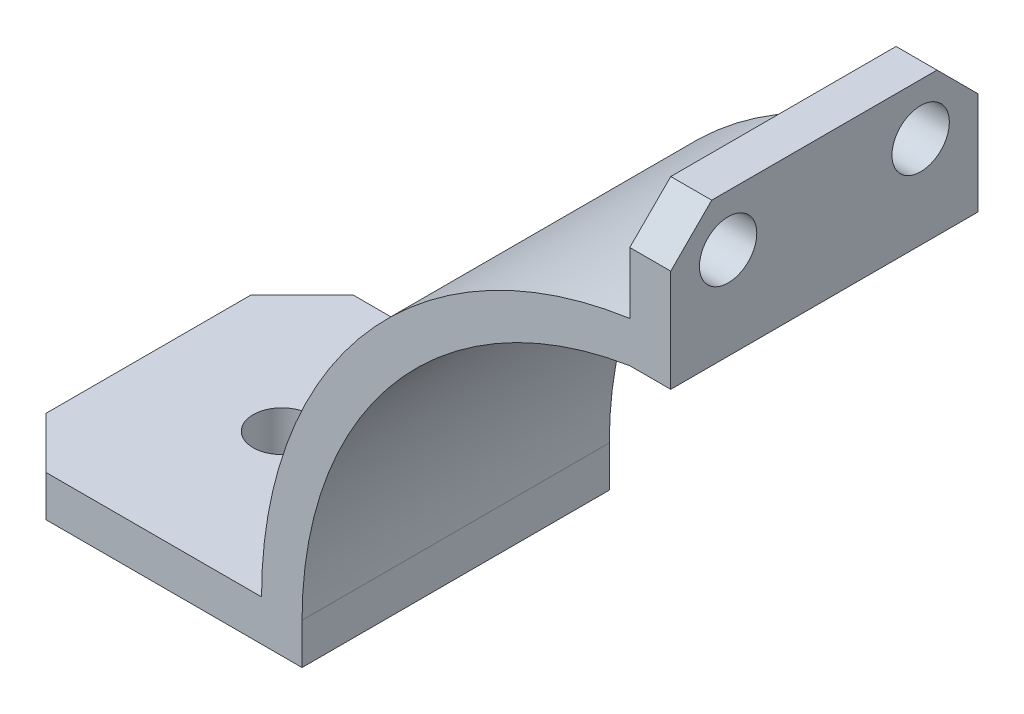
ISO-10303-21;
HEADER;
FILE_DESCRIPTION(('STEP AP214'),'2;1');
FILE_NAME('part.step','',(''),(''),'','','');
FILE_SCHEMA(('AUTOMOTIVE_DESIGN { 1 0 10303 214 1 1 1 1 }'));
ENDSEC;
DATA;
#1=APPLICATION_CONTEXT('core data for automotive mechanical design processes');
#2=APPLICATION_PROTOCOL_DEFINITION('international standard','automotive_design',2000,#1);
#3=PRODUCT_CONTEXT('',#1,'mechanical');
#4=PRODUCT('Part','Part','',(#3));
#5=PRODUCT_RELATED_PRODUCT_CATEGORY('part','',(#4));
#6=PRODUCT_DEFINITION_FORMATION('','',#4);
#7=PRODUCT_DEFINITION_CONTEXT('part definition',#1,'design');
#8=PRODUCT_DEFINITION('design','',#6,#7);
#9=PRODUCT_DEFINITION_SHAPE('','',#8);
#10=(LENGTH_UNIT() NAMED_UNIT(*) SI_UNIT(.MILLI.,.METRE.));
#11=(NAMED_UNIT(*) PLANE_ANGLE_UNIT() SI_UNIT($,.RADIAN.));
#12=(NAMED_UNIT(*) SI_UNIT($,.STERADIAN.) SOLID_ANGLE_UNIT());
#13=UNCERTAINTY_MEASURE_WITH_UNIT(LENGTH_MEASURE(1.E-05),#10,'distance_accuracy_value','');
#14=(GEOMETRIC_REPRESENTATION_CONTEXT(3) GLOBAL_UNCERTAINTY_ASSIGNED_CONTEXT((#13)) GLOBAL_UNIT_ASSIGNED_CONTEXT((#10,
#11,#12)) REPRESENTATION_CONTEXT('',''));
#15=CARTESIAN_POINT('',(0.,0.,0.));
#16=DIRECTION('',(0.,0.,1.));
#17=DIRECTION('',(1.,0.,0.));
#18=AXIS2_PLACEMENT_3D('',#15,#16,#17);
#19=CARTESIAN_POINT('',(0.,0.,15.));
#20=DIRECTION('',(0.,0.,-1.));
#21=DIRECTION('',(-1.,0.,0.));
#22=AXIS2_PLACEMENT_3D('',#19,#20,#21);
#23=CYLINDRICAL_SURFACE('',#22,19.);
#24=CARTESIAN_POINT('',(0.,0.,0.));
#25=DIRECTION('',(0.,0.,-1.));
#26=DIRECTION('',(-1.,0.,0.));
#27=AXIS2_PLACEMENT_3D('',#24,#25,#26);
#28=CIRCLE('',#27,19.);
#29=CARTESIAN_POINT('',(-19.,0.,0.));
#30=VERTEX_POINT('',#29);
#31=CARTESIAN_POINT('',(-3.,18.7616630392937,0.));
#32=VERTEX_POINT('',#31);
#33=EDGE_CURVE('E171',#30,#32,#28,.T.);
#34=ORIENTED_EDGE('',*,*,#33,.T.);
#35=DIRECTION('',(0.,0.,-1.));
#36=VECTOR('',#35,1.);
#37=CARTESIAN_POINT('',(-3.,18.7616630392937,15.));
#38=LINE('',#37,#36);
#39=CARTESIAN_POINT('',(-3.,18.7616630392937,15.));
#40=VERTEX_POINT('',#39);
#41=EDGE_CURVE('E151',#40,#32,#38,.T.);
#42=ORIENTED_EDGE('',*,*,#41,.F.);
#43=CARTESIAN_POINT('',(0.,0.,15.));
#44=DIRECTION('',(0.,0.,-1.));
#45=DIRECTION('',(-1.,0.,0.));
#46=AXIS2_PLACEMENT_3D('',#43,#44,#45);
#47=CIRCLE('',#46,19.);
#48=CARTESIAN_POINT('',(-19.,0.,15.));
#49=VERTEX_POINT('',#48);
#50=EDGE_CURVE('E159',#49,#40,#47,.T.);
#51=ORIENTED_EDGE('',*,*,#50,.F.);
#52=DIRECTION('',(0.,0.,-1.));
#53=VECTOR('',#52,1.);
#54=CARTESIAN_POINT('',(-19.,0.,15.));
#55=LINE('',#54,#53);
#56=EDGE_CURVE('E242',#49,#30,#55,.T.);
#57=ORIENTED_EDGE('',*,*,#56,.T.);
#58=EDGE_LOOP('',(#34,#42,#51,#57));
#59=FACE_BOUND('',#58,.T.);
#60=ADVANCED_FACE('F44',(#59),#23,.F.);
#61=CARTESIAN_POINT('',(-1.,18.7616630392937,15.));
#62=DIRECTION('',(0.,1.,0.));
#63=DIRECTION('',(0.,0.,1.));
#64=AXIS2_PLACEMENT_3D('',#61,#62,#63);
#65=PLANE('',#64);
#66=DIRECTION('',(1.,0.,0.));
#67=VECTOR('',#66,1.);
#68=CARTESIAN_POINT('',(-1.,18.7616630392937,0.));
#69=LINE('',#68,#67);
#70=CARTESIAN_POINT('',(-1.,18.7616630392937,0.));
#71=VERTEX_POINT('',#70);
#72=EDGE_CURVE('E256',#32,#71,#69,.T.);
#73=ORIENTED_EDGE('',*,*,#72,.T.);
#74=DIRECTION('',(0.,0.,-1.));
#75=VECTOR('',#74,1.);
#76=CARTESIAN_POINT('',(-1.,18.7616630392937,15.));
#77=LINE('',#76,#75);
#78=CARTESIAN_POINT('',(-1.,18.7616630392937,15.));
#79=VERTEX_POINT('',#78);
#80=EDGE_CURVE('E154',#79,#71,#77,.T.);
#81=ORIENTED_EDGE('',*,*,#80,.F.);
#82=DIRECTION('',(1.,0.,0.));
#83=VECTOR('',#82,1.);
#84=CARTESIAN_POINT('',(-1.,18.7616630392937,15.));
#85=LINE('',#84,#83);
#86=EDGE_CURVE('E147',#40,#79,#85,.T.);
#87=ORIENTED_EDGE('',*,*,#86,.F.);
#88=ORIENTED_EDGE('',*,*,#41,.T.);
#89=EDGE_LOOP('',(#73,#81,#87,#88));
#90=FACE_BOUND('',#89,.T.);
#91=ADVANCED_FACE('F149',(#90),#65,.F.);
#92=CARTESIAN_POINT('',(-1.,25.7616630392937,15.));
#93=DIRECTION('',(-1.,0.,0.));
#94=DIRECTION('',(0.,-1.,0.));
#95=AXIS2_PLACEMENT_3D('',#92,#93,#94);
#96=PLANE('',#95);
#97=CARTESIAN_POINT('',(-1.,23.2616630392937,2.8));
#98=DIRECTION('',(-1.,0.,0.));
#99=DIRECTION('',(0.,-1.,0.));
#100=AXIS2_PLACEMENT_3D('',#97,#98,#99);
#101=CIRCLE('',#100,1.4);
#102=CARTESIAN_POINT('',(-1.,21.8616630392937,2.8));
#103=VERTEX_POINT('',#102);
#104=EDGE_CURVE('E259',#103,#103,#101,.T.);
#105=ORIENTED_EDGE('',*,*,#104,.T.);
#106=EDGE_LOOP('',(#105));
#107=FACE_BOUND('',#106,.T.);
#108=CARTESIAN_POINT('',(-1.,23.2616630392937,12.2));
#109=DIRECTION('',(-1.,0.,0.));
#110=DIRECTION('',(0.,-1.,0.));
#111=AXIS2_PLACEMENT_3D('',#108,#109,#110);
#112=CIRCLE('',#111,1.4);
#113=CARTESIAN_POINT('',(-1.,21.8616630392937,12.2));
#114=VERTEX_POINT('',#113);
#115=EDGE_CURVE('E271',#114,#114,#112,.T.);
#116=ORIENTED_EDGE('',*,*,#115,.T.);
#117=EDGE_LOOP('',(#116));
#118=FACE_BOUND('',#117,.T.);
#119=DIRECTION('',(0.,0.,-1.));
#120=VECTOR('',#119,1.);
#121=CARTESIAN_POINT('',(-1.,25.7616630392937,15.));
#122=LINE('',#121,#120);
#123=CARTESIAN_POINT('',(-1.,25.7616630392937,13.));
#124=VERTEX_POINT('',#123);
#125=CARTESIAN_POINT('',(-1.,25.7616630392937,2.));
#126=VERTEX_POINT('',#125);
#127=EDGE_CURVE('E176',#124,#126,#122,.T.);
#128=ORIENTED_EDGE('',*,*,#127,.F.);
#129=DIRECTION('',(0.,0.707106781186546,-0.707106781186549));
#130=VECTOR('',#129,1.);
#131=CARTESIAN_POINT('',(-1.,23.7616630392937,15.));
#132=LINE('',#131,#130);
#133=CARTESIAN_POINT('',(-1.,23.7616630392937,15.));
#134=VERTEX_POINT('',#133);
#135=EDGE_CURVE('E53',#124,#134,#132,.F.);
#136=ORIENTED_EDGE('',*,*,#135,.T.);
#137=DIRECTION('',(0.,1.,0.));
#138=VECTOR('',#137,1.);
#139=CARTESIAN_POINT('',(-1.,25.7616630392937,15.));
#140=LINE('',#139,#138);
#141=EDGE_CURVE('E158',#79,#134,#140,.T.);
#142=ORIENTED_EDGE('',*,*,#141,.F.);
#143=ORIENTED_EDGE('',*,*,#80,.T.);
#144=DIRECTION('',(0.,1.,0.));
#145=VECTOR('',#144,1.);
#146=CARTESIAN_POINT('',(-1.,25.7616630392937,0.));
#147=LINE('',#146,#145);
#148=CARTESIAN_POINT('',(-1.,23.7616630392937,0.));
#149=VERTEX_POINT('',#148);
#150=EDGE_CURVE('E254',#71,#149,#147,.T.);
#151=ORIENTED_EDGE('',*,*,#150,.T.);
#152=DIRECTION('',(0.,0.707106781186549,0.707106781186546));
#153=VECTOR('',#152,1.);
#154=CARTESIAN_POINT('',(-1.,25.7616630392937,2.));
#155=LINE('',#154,#153);
#156=EDGE_CURVE('E65',#149,#126,#155,.T.);
#157=ORIENTED_EDGE('',*,*,#156,.T.);
#158=EDGE_LOOP('',(#128,#136,#142,#143,#151,#157));
#159=FACE_BOUND('',#158,.T.);
#160=ADVANCED_FACE('F208',(#107,#118,#159),#96,.F.);
#161=CARTESIAN_POINT('',(-3.,25.7616630392937,15.));
#162=DIRECTION('',(0.,-1.,0.));
#163=DIRECTION('',(0.,0.,-1.));
#164=AXIS2_PLACEMENT_3D('',#161,#162,#163);
#165=PLANE('',#164);
#166=DIRECTION('',(0.,0.,-1.));
#167=VECTOR('',#166,1.);
#168=CARTESIAN_POINT('',(-3.,25.7616630392937,15.));
#169=LINE('',#168,#167);
#170=CARTESIAN_POINT('',(-3.,25.7616630392937,13.));
#171=VERTEX_POINT('',#170);
#172=CARTESIAN_POINT('',(-3.,25.7616630392937,2.));
#173=VERTEX_POINT('',#172);
#174=EDGE_CURVE('E220',#171,#173,#169,.T.);
#175=ORIENTED_EDGE('',*,*,#174,.F.);
#176=DIRECTION('',(1.,0.,0.));
#177=VECTOR('',#176,1.);
#178=CARTESIAN_POINT('',(-3.,25.7616630392937,13.));
#179=LINE('',#178,#177);
#180=EDGE_CURVE('E205',#171,#124,#179,.T.);
#181=ORIENTED_EDGE('',*,*,#180,.T.);
#182=ORIENTED_EDGE('',*,*,#127,.T.);
#183=DIRECTION('',(-1.,0.,0.));
#184=VECTOR('',#183,1.);
#185=CARTESIAN_POINT('',(-3.,25.7616630392937,2.));
#186=LINE('',#185,#184);
#187=EDGE_CURVE('E202',#126,#173,#186,.T.);
#188=ORIENTED_EDGE('',*,*,#187,.T.);
#189=EDGE_LOOP('',(#175,#181,#182,#188));
#190=FACE_BOUND('',#189,.T.);
#191=ADVANCED_FACE('F223',(#190),#165,.F.);
#192=CARTESIAN_POINT('',(-3.,20.7616630392937,15.));
#193=DIRECTION('',(1.,0.,0.));
#194=DIRECTION('',(0.,1.,0.));
#195=AXIS2_PLACEMENT_3D('',#192,#193,#194);
#196=PLANE('',#195);
#197=CARTESIAN_POINT('',(-3.,23.2616630392937,2.8));
#198=DIRECTION('',(-1.,0.,0.));
#199=DIRECTION('',(0.,-1.,0.));
#200=AXIS2_PLACEMENT_3D('',#197,#198,#199);
#201=CIRCLE('',#200,1.4);
#202=CARTESIAN_POINT('',(-3.,21.8616630392937,2.8));
#203=VERTEX_POINT('',#202);
#204=EDGE_CURVE('E274',#203,#203,#201,.T.);
#205=ORIENTED_EDGE('',*,*,#204,.F.);
#206=EDGE_LOOP('',(#205));
#207=FACE_BOUND('',#206,.T.);
#208=CARTESIAN_POINT('',(-3.,23.2616630392937,12.2));
#209=DIRECTION('',(-1.,0.,0.));
#210=DIRECTION('',(0.,-1.,0.));
#211=AXIS2_PLACEMENT_3D('',#208,#209,#210);
#212=CIRCLE('',#211,1.4);
#213=CARTESIAN_POINT('',(-3.,21.8616630392937,12.2));
#214=VERTEX_POINT('',#213);
#215=EDGE_CURVE('E275',#214,#214,#212,.T.);
#216=ORIENTED_EDGE('',*,*,#215,.F.);
#217=EDGE_LOOP('',(#216));
#218=FACE_BOUND('',#217,.T.);
#219=DIRECTION('',(0.,-1.,0.));
#220=VECTOR('',#219,1.);
#221=CARTESIAN_POINT('',(-3.,20.7616630392937,15.));
#222=LINE('',#221,#220);
#223=CARTESIAN_POINT('',(-3.,23.7616630392937,15.));
#224=VERTEX_POINT('',#223);
#225=CARTESIAN_POINT('',(-3.,20.7616630392937,15.));
#226=VERTEX_POINT('',#225);
#227=EDGE_CURVE('E213',#224,#226,#222,.T.);
#228=ORIENTED_EDGE('',*,*,#227,.F.);
#229=DIRECTION('',(0.,-0.707106781186546,0.707106781186549));
#230=VECTOR('',#229,1.);
#231=CARTESIAN_POINT('',(-3.,23.7616630392937,15.));
#232=LINE('',#231,#230);
#233=EDGE_CURVE('E200',#224,#171,#232,.F.);
#234=ORIENTED_EDGE('',*,*,#233,.T.);
#235=ORIENTED_EDGE('',*,*,#174,.T.);
#236=DIRECTION('',(0.,-0.707106781186549,-0.707106781186546));
#237=VECTOR('',#236,1.);
#238=CARTESIAN_POINT('',(-3.,25.7616630392937,2.));
#239=LINE('',#238,#237);
#240=CARTESIAN_POINT('',(-3.,23.7616630392937,0.));
#241=VERTEX_POINT('',#240);
#242=EDGE_CURVE('E198',#173,#241,#239,.T.);
#243=ORIENTED_EDGE('',*,*,#242,.T.);
#244=DIRECTION('',(0.,-1.,0.));
#245=VECTOR('',#244,1.);
#246=CARTESIAN_POINT('',(-3.,20.7616630392937,0.));
#247=LINE('',#246,#245);
#248=CARTESIAN_POINT('',(-3.,20.7616630392937,0.));
#249=VERTEX_POINT('',#248);
#250=EDGE_CURVE('E252',#241,#249,#247,.T.);
#251=ORIENTED_EDGE('',*,*,#250,.T.);
#252=DIRECTION('',(0.,0.,-1.));
#253=VECTOR('',#252,1.);
#254=CARTESIAN_POINT('',(-3.,20.7616630392937,15.));
#255=LINE('',#254,#253);
#256=EDGE_CURVE('E225',#226,#249,#255,.T.);
#257=ORIENTED_EDGE('',*,*,#256,.F.);
#258=EDGE_LOOP('',(#228,#234,#235,#243,#251,#257));
#259=FACE_BOUND('',#258,.T.);
#260=ADVANCED_FACE('F219',(#207,#218,#259),#196,.F.);
#261=CARTESIAN_POINT('',(0.,0.,15.));
#262=DIRECTION('',(0.,0.,-1.));
#263=DIRECTION('',(-1.,0.,0.));
#264=AXIS2_PLACEMENT_3D('',#261,#262,#263);
#265=CYLINDRICAL_SURFACE('',#264,20.9772889610925);
#266=CARTESIAN_POINT('',(0.,0.,0.));
#267=DIRECTION('',(0.,0.,1.));
#268=DIRECTION('',(-1.,0.,0.));
#269=AXIS2_PLACEMENT_3D('',#266,#267,#268);
#270=CIRCLE('',#269,20.9772889610925);
#271=CARTESIAN_POINT('',(-20.9772889610925,0.,0.));
#272=VERTEX_POINT('',#271);
#273=EDGE_CURVE('E250',#249,#272,#270,.T.);
#274=ORIENTED_EDGE('',*,*,#273,.T.);
#275=DIRECTION('',(0.,0.,-1.));
#276=VECTOR('',#275,1.);
#277=CARTESIAN_POINT('',(-20.9772889610925,0.,15.));
#278=LINE('',#277,#276);
#279=CARTESIAN_POINT('',(-20.9772889610925,0.,15.));
#280=VERTEX_POINT('',#279);
#281=EDGE_CURVE('E228',#280,#272,#278,.T.);
#282=ORIENTED_EDGE('',*,*,#281,.F.);
#283=CARTESIAN_POINT('',(0.,0.,15.));
#284=DIRECTION('',(0.,0.,1.));
#285=DIRECTION('',(-1.,0.,0.));
#286=AXIS2_PLACEMENT_3D('',#283,#284,#285);
#287=CIRCLE('',#286,20.9772889610925);
#288=EDGE_CURVE('E266',#226,#280,#287,.T.);
#289=ORIENTED_EDGE('',*,*,#288,.F.);
#290=ORIENTED_EDGE('',*,*,#256,.T.);
#291=EDGE_LOOP('',(#274,#282,#289,#290));
#292=FACE_BOUND('',#291,.T.);
#293=ADVANCED_FACE('F300',(#292),#265,.T.);
#294=CARTESIAN_POINT('',(-34.,0.,15.));
#295=DIRECTION('',(0.,-1.,0.));
#296=DIRECTION('',(0.,0.,-1.));
#297=AXIS2_PLACEMENT_3D('',#294,#295,#296);
#298=PLANE('',#297);
#299=CARTESIAN_POINT('',(-27.4886444805463,0.,7.5));
#300=DIRECTION('',(0.,1.,0.));
#301=DIRECTION('',(0.,0.,1.));
#302=AXIS2_PLACEMENT_3D('',#299,#300,#301);
#303=CIRCLE('',#302,1.4);
#304=CARTESIAN_POINT('',(-27.4886444805463,0.,8.9));
#305=VERTEX_POINT('',#304);
#306=EDGE_CURVE('E281',#305,#305,#303,.T.);
#307=ORIENTED_EDGE('',*,*,#306,.F.);
#308=EDGE_LOOP('',(#307));
#309=FACE_BOUND('',#308,.T.);
#310=DIRECTION('',(-1.,0.,0.));
#311=VECTOR('',#310,1.);
#312=CARTESIAN_POINT('',(-34.,0.,0.));
#313=LINE('',#312,#311);
#314=CARTESIAN_POINT('',(-31.5,0.,0.));
#315=VERTEX_POINT('',#314);
#316=EDGE_CURVE('E247',#272,#315,#313,.T.);
#317=ORIENTED_EDGE('',*,*,#316,.T.);
#318=DIRECTION('',(-0.707106781186549,0.,0.707106781186547));
#319=VECTOR('',#318,1.);
#320=CARTESIAN_POINT('',(-34.,0.,2.5));
#321=LINE('',#320,#319);
#322=CARTESIAN_POINT('',(-34.,0.,2.5));
#323=VERTEX_POINT('',#322);
#324=EDGE_CURVE('E190',#315,#323,#321,.T.);
#325=ORIENTED_EDGE('',*,*,#324,.T.);
#326=DIRECTION('',(0.,0.,-1.));
#327=VECTOR('',#326,1.);
#328=CARTESIAN_POINT('',(-34.,0.,15.));
#329=LINE('',#328,#327);
#330=CARTESIAN_POINT('',(-34.,0.,12.5));
#331=VERTEX_POINT('',#330);
#332=EDGE_CURVE('E233',#331,#323,#329,.T.);
#333=ORIENTED_EDGE('',*,*,#332,.F.);
#334=DIRECTION('',(-0.707106781186548,0.,-0.707106781186548));
#335=VECTOR('',#334,1.);
#336=CARTESIAN_POINT('',(-31.5,0.,15.));
#337=LINE('',#336,#335);
#338=CARTESIAN_POINT('',(-31.5,0.,15.));
#339=VERTEX_POINT('',#338);
#340=EDGE_CURVE('E188',#331,#339,#337,.F.);
#341=ORIENTED_EDGE('',*,*,#340,.T.);
#342=DIRECTION('',(-1.,0.,0.));
#343=VECTOR('',#342,1.);
#344=CARTESIAN_POINT('',(-34.,0.,15.));
#345=LINE('',#344,#343);
#346=EDGE_CURVE('E263',#280,#339,#345,.T.);
#347=ORIENTED_EDGE('',*,*,#346,.F.);
#348=ORIENTED_EDGE('',*,*,#281,.T.);
#349=EDGE_LOOP('',(#317,#325,#333,#341,#347,#348));
#350=FACE_BOUND('',#349,.T.);
#351=ADVANCED_FACE('F296',(#309,#350),#298,.F.);
#352=CARTESIAN_POINT('',(-34.,-2.,15.));
#353=DIRECTION('',(1.,0.,0.));
#354=DIRECTION('',(0.,0.,-1.));
#355=AXIS2_PLACEMENT_3D('',#352,#353,#354);
#356=PLANE('',#355);
#357=ORIENTED_EDGE('',*,*,#332,.T.);
#358=DIRECTION('',(0.,-1.,0.));
#359=VECTOR('',#358,1.);
#360=CARTESIAN_POINT('',(-34.,-2.,2.5));
#361=LINE('',#360,#359);
#362=CARTESIAN_POINT('',(-34.,-2.,2.5));
#363=VERTEX_POINT('',#362);
#364=EDGE_CURVE('E174',#323,#363,#361,.T.);
#365=ORIENTED_EDGE('',*,*,#364,.T.);
#366=DIRECTION('',(0.,0.,-1.));
#367=VECTOR('',#366,1.);
#368=CARTESIAN_POINT('',(-34.,-2.,15.));
#369=LINE('',#368,#367);
#370=CARTESIAN_POINT('',(-34.,-2.,12.5));
#371=VERTEX_POINT('',#370);
#372=EDGE_CURVE('E236',#371,#363,#369,.T.);
#373=ORIENTED_EDGE('',*,*,#372,.F.);
#374=DIRECTION('',(0.,1.,0.));
#375=VECTOR('',#374,1.);
#376=CARTESIAN_POINT('',(-34.,-2.,12.5));
#377=LINE('',#376,#375);
#378=EDGE_CURVE('E172',#371,#331,#377,.T.);
#379=ORIENTED_EDGE('',*,*,#378,.T.);
#380=EDGE_LOOP('',(#357,#365,#373,#379));
#381=FACE_BOUND('',#380,.T.);
#382=ADVANCED_FACE('F299',(#381),#356,.F.);
#383=CARTESIAN_POINT('',(-19.,-2.,15.));
#384=DIRECTION('',(0.,1.,0.));
#385=DIRECTION('',(-1.,0.,0.));
#386=AXIS2_PLACEMENT_3D('',#383,#384,#385);
#387=PLANE('',#386);
#388=CARTESIAN_POINT('',(-27.4886444805463,-2.,7.5));
#389=DIRECTION('',(0.,1.,0.));
#390=DIRECTION('',(0.,0.,1.));
#391=AXIS2_PLACEMENT_3D('',#388,#389,#390);
#392=CIRCLE('',#391,1.4);
#393=CARTESIAN_POINT('',(-27.4886444805463,-2.,8.9));
#394=VERTEX_POINT('',#393);
#395=EDGE_CURVE('E278',#394,#394,#392,.T.);
#396=ORIENTED_EDGE('',*,*,#395,.T.);
#397=EDGE_LOOP('',(#396));
#398=FACE_BOUND('',#397,.T.);
#399=ORIENTED_EDGE('',*,*,#372,.T.);
#400=DIRECTION('',(0.707106781186549,0.,-0.707106781186547));
#401=VECTOR('',#400,1.);
#402=CARTESIAN_POINT('',(-34.,-2.,2.5));
#403=LINE('',#402,#401);
#404=CARTESIAN_POINT('',(-31.5,-2.,0.));
#405=VERTEX_POINT('',#404);
#406=EDGE_CURVE('E184',#363,#405,#403,.T.);
#407=ORIENTED_EDGE('',*,*,#406,.T.);
#408=DIRECTION('',(1.,0.,0.));
#409=VECTOR('',#408,1.);
#410=CARTESIAN_POINT('',(-19.,-2.,0.));
#411=LINE('',#410,#409);
#412=CARTESIAN_POINT('',(-19.,-2.,0.));
#413=VERTEX_POINT('',#412);
#414=EDGE_CURVE('E245',#405,#413,#411,.T.);
#415=ORIENTED_EDGE('',*,*,#414,.T.);
#416=DIRECTION('',(0.,0.,-1.));
#417=VECTOR('',#416,1.);
#418=CARTESIAN_POINT('',(-19.,-2.,15.));
#419=LINE('',#418,#417);
#420=CARTESIAN_POINT('',(-19.,-2.,15.));
#421=VERTEX_POINT('',#420);
#422=EDGE_CURVE('E239',#421,#413,#419,.T.);
#423=ORIENTED_EDGE('',*,*,#422,.F.);
#424=DIRECTION('',(1.,0.,0.));
#425=VECTOR('',#424,1.);
#426=CARTESIAN_POINT('',(-19.,-2.,15.));
#427=LINE('',#426,#425);
#428=CARTESIAN_POINT('',(-31.5,-2.,15.));
#429=VERTEX_POINT('',#428);
#430=EDGE_CURVE('E261',#429,#421,#427,.T.);
#431=ORIENTED_EDGE('',*,*,#430,.F.);
#432=DIRECTION('',(0.707106781186548,0.,0.707106781186548));
#433=VECTOR('',#432,1.);
#434=CARTESIAN_POINT('',(-31.5,-2.,15.));
#435=LINE('',#434,#433);
#436=EDGE_CURVE('E182',#429,#371,#435,.F.);
#437=ORIENTED_EDGE('',*,*,#436,.T.);
#438=EDGE_LOOP('',(#399,#407,#415,#423,#431,#437));
#439=FACE_BOUND('',#438,.T.);
#440=ADVANCED_FACE('F287',(#398,#439),#387,.F.);
#441=CARTESIAN_POINT('',(-19.,0.,15.));
#442=DIRECTION('',(-1.,0.,0.));
#443=DIRECTION('',(0.,0.,1.));
#444=AXIS2_PLACEMENT_3D('',#441,#442,#443);
#445=PLANE('',#444);
#446=DIRECTION('',(0.,1.,0.));
#447=VECTOR('',#446,1.);
#448=CARTESIAN_POINT('',(-19.,0.,0.));
#449=LINE('',#448,#447);
#450=EDGE_CURVE('E168',#413,#30,#449,.T.);
#451=ORIENTED_EDGE('',*,*,#450,.T.);
#452=ORIENTED_EDGE('',*,*,#56,.F.);
#453=DIRECTION('',(0.,1.,0.));
#454=VECTOR('',#453,1.);
#455=CARTESIAN_POINT('',(-19.,0.,15.));
#456=LINE('',#455,#454);
#457=EDGE_CURVE('E164',#421,#49,#456,.T.);
#458=ORIENTED_EDGE('',*,*,#457,.F.);
#459=ORIENTED_EDGE('',*,*,#422,.T.);
#460=EDGE_LOOP('',(#451,#452,#458,#459));
#461=FACE_BOUND('',#460,.T.);
#462=ADVANCED_FACE('F368',(#461),#445,.F.);
#463=CARTESIAN_POINT('',(0.,0.,15.));
#464=DIRECTION('',(0.,0.,-1.));
#465=DIRECTION('',(-1.,0.,0.));
#466=AXIS2_PLACEMENT_3D('',#463,#464,#465);
#467=PLANE('',#466);
#468=ORIENTED_EDGE('',*,*,#141,.T.);
#469=DIRECTION('',(-1.,0.,0.));
#470=VECTOR('',#469,1.);
#471=CARTESIAN_POINT('',(0.,23.7616630392937,15.));
#472=LINE('',#471,#470);
#473=EDGE_CURVE('E195',#134,#224,#472,.T.);
#474=ORIENTED_EDGE('',*,*,#473,.T.);
#475=ORIENTED_EDGE('',*,*,#227,.T.);
#476=ORIENTED_EDGE('',*,*,#288,.T.);
#477=ORIENTED_EDGE('',*,*,#346,.T.);
#478=DIRECTION('',(0.,-1.,0.));
#479=VECTOR('',#478,1.);
#480=CARTESIAN_POINT('',(-31.5,0.,15.));
#481=LINE('',#480,#479);
#482=EDGE_CURVE('E192',#339,#429,#481,.T.);
#483=ORIENTED_EDGE('',*,*,#482,.T.);
#484=ORIENTED_EDGE('',*,*,#430,.T.);
#485=ORIENTED_EDGE('',*,*,#457,.T.);
#486=ORIENTED_EDGE('',*,*,#50,.T.);
#487=ORIENTED_EDGE('',*,*,#86,.T.);
#488=EDGE_LOOP('',(#468,#474,#475,#476,#477,#483,#484,#485,#486,#487));
#489=FACE_BOUND('',#488,.T.);
#490=ADVANCED_FACE('F162',(#489),#467,.F.);
#491=CARTESIAN_POINT('',(0.,0.,0.));
#492=DIRECTION('',(0.,0.,-1.));
#493=DIRECTION('',(-1.,0.,0.));
#494=AXIS2_PLACEMENT_3D('',#491,#492,#493);
#495=PLANE('',#494);
#496=ORIENTED_EDGE('',*,*,#250,.F.);
#497=DIRECTION('',(1.,0.,0.));
#498=VECTOR('',#497,1.);
#499=CARTESIAN_POINT('',(-1.,23.7616630392937,0.));
#500=LINE('',#499,#498);
#501=EDGE_CURVE('E11',#241,#149,#500,.T.);
#502=ORIENTED_EDGE('',*,*,#501,.T.);
#503=ORIENTED_EDGE('',*,*,#150,.F.);
#504=ORIENTED_EDGE('',*,*,#72,.F.);
#505=ORIENTED_EDGE('',*,*,#33,.F.);
#506=ORIENTED_EDGE('',*,*,#450,.F.);
#507=ORIENTED_EDGE('',*,*,#414,.F.);
#508=DIRECTION('',(0.,1.,0.));
#509=VECTOR('',#508,1.);
#510=CARTESIAN_POINT('',(-31.5,0.,0.));
#511=LINE('',#510,#509);
#512=EDGE_CURVE('E186',#405,#315,#511,.T.);
#513=ORIENTED_EDGE('',*,*,#512,.T.);
#514=ORIENTED_EDGE('',*,*,#316,.F.);
#515=ORIENTED_EDGE('',*,*,#273,.F.);
#516=EDGE_LOOP('',(#496,#502,#503,#504,#505,#506,#507,#513,#514,#515));
#517=FACE_BOUND('',#516,.T.);
#518=ADVANCED_FACE('F324',(#517),#495,.T.);
#519=CARTESIAN_POINT('',(-34.,-2.,2.5));
#520=DIRECTION('',(-0.707106781186547,0.,-0.707106781186549));
#521=DIRECTION('',(0.,1.,0.));
#522=AXIS2_PLACEMENT_3D('',#519,#520,#521);
#523=PLANE('',#522);
#524=ORIENTED_EDGE('',*,*,#324,.F.);
#525=ORIENTED_EDGE('',*,*,#512,.F.);
#526=ORIENTED_EDGE('',*,*,#406,.F.);
#527=ORIENTED_EDGE('',*,*,#364,.F.);
#528=EDGE_LOOP('',(#524,#525,#526,#527));
#529=FACE_BOUND('',#528,.T.);
#530=ADVANCED_FACE('F311',(#529),#523,.T.);
#531=CARTESIAN_POINT('',(-31.5,0.,15.));
#532=DIRECTION('',(0.707106781186547,0.,-0.707106781186547));
#533=DIRECTION('',(0.,-1.,0.));
#534=AXIS2_PLACEMENT_3D('',#531,#532,#533);
#535=PLANE('',#534);
#536=ORIENTED_EDGE('',*,*,#340,.F.);
#537=ORIENTED_EDGE('',*,*,#378,.F.);
#538=ORIENTED_EDGE('',*,*,#436,.F.);
#539=ORIENTED_EDGE('',*,*,#482,.F.);
#540=EDGE_LOOP('',(#536,#537,#538,#539));
#541=FACE_BOUND('',#540,.T.);
#542=ADVANCED_FACE('F321',(#541),#535,.F.);
#543=CARTESIAN_POINT('',(12.,23.2616630392937,12.2));
#544=DIRECTION('',(-1.,0.,0.));
#545=DIRECTION('',(0.,-1.,0.));
#546=AXIS2_PLACEMENT_3D('',#543,#544,#545);
#547=CYLINDRICAL_SURFACE('',#546,1.4);
#548=ORIENTED_EDGE('',*,*,#215,.T.);
#549=EDGE_LOOP('',(#548));
#550=FACE_BOUND('',#549,.T.);
#551=ORIENTED_EDGE('',*,*,#115,.F.);
#552=EDGE_LOOP('',(#551));
#553=FACE_BOUND('',#552,.T.);
#554=ADVANCED_FACE('F349',(#550,#553),#547,.F.);
#555=CARTESIAN_POINT('',(12.,23.2616630392937,2.8));
#556=DIRECTION('',(-1.,0.,0.));
#557=DIRECTION('',(0.,-1.,0.));
#558=AXIS2_PLACEMENT_3D('',#555,#556,#557);
#559=CYLINDRICAL_SURFACE('',#558,1.4);
#560=ORIENTED_EDGE('',*,*,#204,.T.);
#561=EDGE_LOOP('',(#560));
#562=FACE_BOUND('',#561,.T.);
#563=ORIENTED_EDGE('',*,*,#104,.F.);
#564=EDGE_LOOP('',(#563));
#565=FACE_BOUND('',#564,.T.);
#566=ADVANCED_FACE('F330',(#562,#565),#559,.F.);
#567=CARTESIAN_POINT('',(0.,23.7616630392937,15.));
#568=DIRECTION('',(0.,-0.707106781186549,-0.707106781186546));
#569=DIRECTION('',(-1.,0.,0.));
#570=AXIS2_PLACEMENT_3D('',#567,#568,#569);
#571=PLANE('',#570);
#572=ORIENTED_EDGE('',*,*,#135,.F.);
#573=ORIENTED_EDGE('',*,*,#180,.F.);
#574=ORIENTED_EDGE('',*,*,#233,.F.);
#575=ORIENTED_EDGE('',*,*,#473,.F.);
#576=EDGE_LOOP('',(#572,#573,#574,#575));
#577=FACE_BOUND('',#576,.T.);
#578=ADVANCED_FACE('F215',(#577),#571,.F.);
#579=CARTESIAN_POINT('',(-3.,25.7616630392937,2.));
#580=DIRECTION('',(0.,0.707106781186546,-0.707106781186549));
#581=DIRECTION('',(1.,0.,0.));
#582=AXIS2_PLACEMENT_3D('',#579,#580,#581);
#583=PLANE('',#582);
#584=ORIENTED_EDGE('',*,*,#156,.F.);
#585=ORIENTED_EDGE('',*,*,#501,.F.);
#586=ORIENTED_EDGE('',*,*,#242,.F.);
#587=ORIENTED_EDGE('',*,*,#187,.F.);
#588=EDGE_LOOP('',(#584,#585,#586,#587));
#589=FACE_BOUND('',#588,.T.);
#590=ADVANCED_FACE('F47',(#589),#583,.T.);
#591=CARTESIAN_POINT('',(-27.4886444805463,-2.,7.5));
#592=DIRECTION('',(0.,1.,0.));
#593=DIRECTION('',(0.,0.,1.));
#594=AXIS2_PLACEMENT_3D('',#591,#592,#593);
#595=CYLINDRICAL_SURFACE('',#594,1.4);
#596=ORIENTED_EDGE('',*,*,#395,.F.);
#597=EDGE_LOOP('',(#596));
#598=FACE_BOUND('',#597,.T.);
#599=ORIENTED_EDGE('',*,*,#306,.T.);
#600=EDGE_LOOP('',(#599));
#601=FACE_BOUND('',#600,.T.);
#602=ADVANCED_FACE('F290',(#598,#601),#595,.F.);
#603=CLOSED_SHELL('',(#60,#91,#160,#191,#260,#293,#351,#382,#440,#462,#490,#518,#530,#542,#554,
#566,#578,#590,#602));
#604=MANIFOLD_SOLID_BREP('B2',#603);
#605=ADVANCED_BREP_SHAPE_REPRESENTATION('',(#18,#604),#14);
#606=SHAPE_DEFINITION_REPRESENTATION(#9,#605);
ENDSEC;
END-ISO-10303-21;
